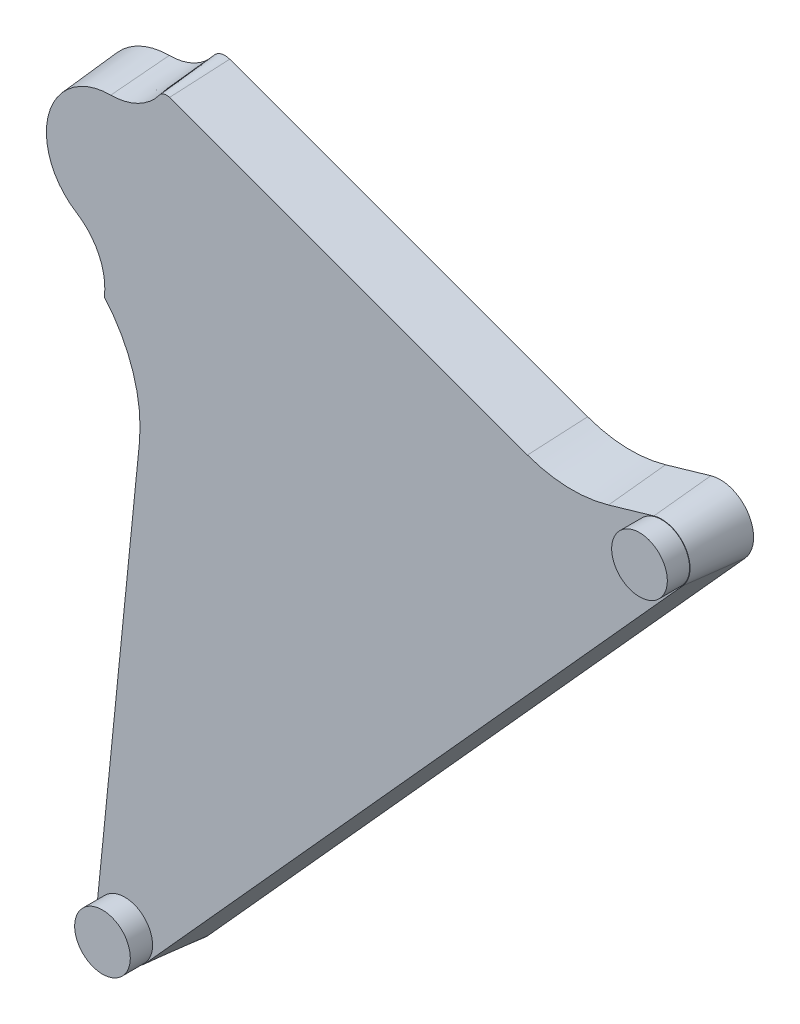
ISO-10303-21;
HEADER;
FILE_DESCRIPTION(('STEP AP214'),'2;1');
FILE_NAME('part.step','',(''),(''),'','','');
FILE_SCHEMA(('AUTOMOTIVE_DESIGN { 1 0 10303 214 1 1 1 1 }'));
ENDSEC;
DATA;
#1=APPLICATION_CONTEXT('core data for automotive mechanical design processes');
#2=APPLICATION_PROTOCOL_DEFINITION('international standard','automotive_design',2000,#1);
#3=PRODUCT_CONTEXT('',#1,'mechanical');
#4=PRODUCT('Part','Part','',(#3));
#5=PRODUCT_RELATED_PRODUCT_CATEGORY('part','',(#4));
#6=PRODUCT_DEFINITION_FORMATION('','',#4);
#7=PRODUCT_DEFINITION_CONTEXT('part definition',#1,'design');
#8=PRODUCT_DEFINITION('design','',#6,#7);
#9=PRODUCT_DEFINITION_SHAPE('','',#8);
#10=(LENGTH_UNIT() NAMED_UNIT(*) SI_UNIT(.MILLI.,.METRE.));
#11=(NAMED_UNIT(*) PLANE_ANGLE_UNIT() SI_UNIT($,.RADIAN.));
#12=(NAMED_UNIT(*) SI_UNIT($,.STERADIAN.) SOLID_ANGLE_UNIT());
#13=UNCERTAINTY_MEASURE_WITH_UNIT(LENGTH_MEASURE(1.E-05),#10,'distance_accuracy_value','');
#14=(GEOMETRIC_REPRESENTATION_CONTEXT(3) GLOBAL_UNCERTAINTY_ASSIGNED_CONTEXT((#13)) GLOBAL_UNIT_ASSIGNED_CONTEXT((#10,
#11,#12)) REPRESENTATION_CONTEXT('',''));
#15=CARTESIAN_POINT('',(0.,0.,0.));
#16=DIRECTION('',(0.,0.,1.));
#17=DIRECTION('',(1.,0.,0.));
#18=AXIS2_PLACEMENT_3D('',#15,#16,#17);
#19=CARTESIAN_POINT('',(-24.,-38.0657326213486,0.));
#20=DIRECTION('',(0.,0.,1.));
#21=DIRECTION('',(1.,0.,0.));
#22=AXIS2_PLACEMENT_3D('',#19,#20,#21);
#23=CONICAL_SURFACE('',#22,20.,0.0872664625997167);
#24=CARTESIAN_POINT('',(-24.,-38.0657326213486,0.));
#25=DIRECTION('',(0.,0.,-1.));
#26=DIRECTION('',(1.,0.,0.));
#27=AXIS2_PLACEMENT_3D('',#24,#25,#26);
#28=CIRCLE('',#27,20.);
#29=CARTESIAN_POINT('',(-13.3333333333333,-21.1476292340825,0.));
#30=VERTEX_POINT('',#29);
#31=CARTESIAN_POINT('',(-4.28464979789088,-41.4280185116614,0.));
#32=VERTEX_POINT('',#31);
#33=EDGE_CURVE('E129',#30,#32,#28,.T.);
#34=ORIENTED_EDGE('',*,*,#33,.T.);
#35=CARTESIAN_POINT('',(-2.34073281736119,-40.8482052424433,21.));
#36=CARTESIAN_POINT('',(-2.50139442564413,-40.8971555313612,19.2498944760869));
#37=CARTESIAN_POINT('',(-2.6623640559333,-40.945959511817,17.499813119764));
#38=CARTESIAN_POINT('',(-2.98495600856319,-41.0432574008663,13.9997022828302));
#39=CARTESIAN_POINT('',(-3.14657833077965,-41.0917513095186,12.2496728022095));
#40=CARTESIAN_POINT('',(-3.47051238027014,-41.1884116198143,8.74966854954999));
#41=CARTESIAN_POINT('',(-3.63282410756043,-41.2365780214499,6.99969377751241));
#42=CARTESIAN_POINT('',(-3.95817844022917,-41.3325636094536,3.49980232151207));
#43=CARTESIAN_POINT('',(-4.12122104574678,-41.3803827957556,1.74988563756043));
#44=CARTESIAN_POINT('',(-4.28464979789071,-41.4280185116616,0.));
#45=B_SPLINE_CURVE_WITH_KNOTS('',3,(#35,#36,#37,#38,#39,#40,#41,#42,#43,#44),.UNSPECIFIED.,.F.,
.F.,(4,2,2,2,4),(0.,5.27443822189284,10.5488754395707,15.8233127815579,21.0977511278854),.UNSPECIFIED.);
#46=CARTESIAN_POINT('',(-2.34073281736119,-40.8482052424433,21.));
#47=VERTEX_POINT('',#46);
#48=EDGE_CURVE('E11',#47,#32,#45,.T.);
#49=ORIENTED_EDGE('',*,*,#48,.F.);
#50=CARTESIAN_POINT('',(-24.,-38.0657326213486,21.));
#51=DIRECTION('',(0.,0.,1.));
#52=DIRECTION('',(1.,0.,0.));
#53=AXIS2_PLACEMENT_3D('',#50,#51,#52);
#54=CIRCLE('',#53,21.8372619340444);
#55=CARTESIAN_POINT('',(-12.353460301843,-19.5934798665999,21.));
#56=VERTEX_POINT('',#55);
#57=EDGE_CURVE('E168',#56,#47,#54,.F.);
#58=ORIENTED_EDGE('',*,*,#57,.F.);
#59=DIRECTION('',(-0.0464830627987511,-0.0737254933299423,-0.996194698091745));
#60=VECTOR('',#59,1.);
#61=CARTESIAN_POINT('',(-13.3333333333333,-21.1476292340825,0.));
#62=LINE('',#61,#60);
#63=EDGE_CURVE('E142',#56,#30,#62,.T.);
#64=ORIENTED_EDGE('',*,*,#63,.T.);
#65=EDGE_LOOP('',(#34,#49,#58,#64));
#66=FACE_BOUND('',#65,.T.);
#67=ADVANCED_FACE('F35',(#66),#23,.F.);
#68=CARTESIAN_POINT('',(-41.3376126881464,-75.,0.));
#69=DIRECTION('',(0.,0.,1.));
#70=DIRECTION('',(1.,0.,0.));
#71=AXIS2_PLACEMENT_3D('',#68,#69,#70);
#72=CONICAL_SURFACE('',#71,50.,0.0872664625997167);
#73=CARTESIAN_POINT('',(-41.3376126881464,-75.,0.));
#74=DIRECTION('',(0.,0.,-1.));
#75=DIRECTION('',(1.,0.,0.));
#76=AXIS2_PLACEMENT_3D('',#73,#74,#75);
#77=CIRCLE('',#76,50.);
#78=CARTESIAN_POINT('',(8.4117591671846,-80.,0.));
#79=VERTEX_POINT('',#78);
#80=EDGE_CURVE('E125',#32,#79,#77,.T.);
#81=ORIENTED_EDGE('',*,*,#80,.T.);
#82=DIRECTION('',(-0.0867188691056165,0.00871557427476584,-0.996194698091745));
#83=VECTOR('',#82,1.);
#84=CARTESIAN_POINT('',(8.4117591671846,-80.,0.));
#85=LINE('',#84,#83);
#86=CARTESIAN_POINT('',(10.239811710233,-80.1837261934045,21.));
#87=VERTEX_POINT('',#86);
#88=EDGE_CURVE('E44',#87,#79,#85,.T.);
#89=ORIENTED_EDGE('',*,*,#88,.F.);
#90=CARTESIAN_POINT('',(-41.3376126881464,-75.,21.));
#91=DIRECTION('',(0.,0.,1.));
#92=DIRECTION('',(1.,0.,0.));
#93=AXIS2_PLACEMENT_3D('',#90,#91,#92);
#94=CIRCLE('',#93,51.8372619340444);
#95=EDGE_CURVE('E138',#47,#87,#94,.F.);
#96=ORIENTED_EDGE('',*,*,#95,.F.);
#97=ORIENTED_EDGE('',*,*,#48,.T.);
#98=EDGE_LOOP('',(#81,#89,#96,#97));
#99=FACE_BOUND('',#98,.T.);
#100=ADVANCED_FACE('F137',(#99),#72,.F.);
#101=CARTESIAN_POINT('',(-6.93984924527944,-232.74657509782,0.));
#102=DIRECTION('',(-0.991201209513509,0.0996194698091746,0.0871557427476584));
#103=DIRECTION('',(-0.1,-0.99498743710662,0.));
#104=AXIS2_PLACEMENT_3D('',#101,#102,#103);
#105=PLANE('',#104);
#106=DIRECTION('',(-0.1,-0.99498743710662,0.));
#107=VECTOR('',#106,1.);
#108=CARTESIAN_POINT('',(-6.93984924527944,-232.74657509782,0.));
#109=LINE('',#108,#107);
#110=CARTESIAN_POINT('',(-6.93984924527946,-232.74657509782,0.));
#111=VERTEX_POINT('',#110);
#112=EDGE_CURVE('E131',#79,#111,#109,.T.);
#113=ORIENTED_EDGE('',*,*,#112,.T.);
#114=DIRECTION('',(-0.0867188691056165,0.00871557427476587,-0.996194698091745));
#115=VECTOR('',#114,1.);
#116=CARTESIAN_POINT('',(-6.93984924527946,-232.74657509782,0.));
#117=LINE('',#116,#115);
#118=CARTESIAN_POINT('',(-5.11179670223106,-232.930301291225,21.));
#119=VERTEX_POINT('',#118);
#120=EDGE_CURVE('E227',#119,#111,#117,.T.);
#121=ORIENTED_EDGE('',*,*,#120,.F.);
#122=DIRECTION('',(0.1,0.99498743710662,0.));
#123=VECTOR('',#122,1.);
#124=CARTESIAN_POINT('',(-5.11179670223104,-232.930301291225,21.));
#125=LINE('',#124,#123);
#126=EDGE_CURVE('E256',#87,#119,#125,.F.);
#127=ORIENTED_EDGE('',*,*,#126,.F.);
#128=ORIENTED_EDGE('',*,*,#88,.T.);
#129=EDGE_LOOP('',(#113,#121,#127,#128));
#130=FACE_BOUND('',#129,.T.);
#131=ADVANCED_FACE('F37',(#130),#105,.T.);
#132=CARTESIAN_POINT('',(5.,-233.94657509782,0.));
#133=DIRECTION('',(0.,0.,-1.));
#134=DIRECTION('',(1.,0.,0.));
#135=AXIS2_PLACEMENT_3D('',#132,#133,#134);
#136=CONICAL_SURFACE('',#135,12.,0.0872664625997167);
#137=CARTESIAN_POINT('',(5.,-233.94657509782,0.));
#138=DIRECTION('',(0.,0.,1.));
#139=DIRECTION('',(1.,0.,0.));
#140=AXIS2_PLACEMENT_3D('',#137,#138,#139);
#141=CIRCLE('',#140,12.);
#142=CARTESIAN_POINT('',(13.9104016148233,-241.984282672904,0.));
#143=VERTEX_POINT('',#142);
#144=EDGE_CURVE('E151',#111,#143,#141,.T.);
#145=ORIENTED_EDGE('',*,*,#144,.T.);
#146=DIRECTION('',(0.064716055909988,-0.058377697807907,-0.996194698091745));
#147=VECTOR('',#146,1.);
#148=CARTESIAN_POINT('',(13.9104016148232,-241.984282672904,0.));
#149=LINE('',#148,#147);
#150=CARTESIAN_POINT('',(12.546173139493,-240.75366815918,21.));
#151=VERTEX_POINT('',#150);
#152=EDGE_CURVE('E224',#151,#143,#149,.T.);
#153=ORIENTED_EDGE('',*,*,#152,.F.);
#154=CARTESIAN_POINT('',(5.,-233.94657509782,21.));
#155=DIRECTION('',(0.,0.,1.));
#156=DIRECTION('',(1.,0.,0.));
#157=AXIS2_PLACEMENT_3D('',#154,#155,#156);
#158=CIRCLE('',#157,10.1627380659556);
#159=EDGE_CURVE('E258',#119,#151,#158,.T.);
#160=ORIENTED_EDGE('',*,*,#159,.F.);
#161=ORIENTED_EDGE('',*,*,#120,.T.);
#162=EDGE_LOOP('',(#145,#153,#160,#161));
#163=FACE_BOUND('',#162,.T.);
#164=ADVANCED_FACE('F212',(#163),#136,.T.);
#165=CARTESIAN_POINT('',(206.902825712312,-28.0377075750835,0.));
#166=DIRECTION('',(0.739707903879589,-0.667260139259172,0.0871557427476584));
#167=DIRECTION('',(0.669808964590293,0.742533467901939,0.));
#168=AXIS2_PLACEMENT_3D('',#165,#166,#167);
#169=PLANE('',#168);
#170=DIRECTION('',(0.669808964590293,0.742533467901939,0.));
#171=VECTOR('',#170,1.);
#172=CARTESIAN_POINT('',(206.902825712312,-28.0377075750835,0.));
#173=LINE('',#172,#171);
#174=CARTESIAN_POINT('',(206.902825712312,-28.0377075750835,0.));
#175=VERTEX_POINT('',#174);
#176=EDGE_CURVE('E153',#143,#175,#173,.T.);
#177=ORIENTED_EDGE('',*,*,#176,.T.);
#178=DIRECTION('',(0.0647160559099881,-0.0583776978079069,-0.996194698091745));
#179=VECTOR('',#178,1.);
#180=CARTESIAN_POINT('',(206.902825712312,-28.0377075750835,0.));
#181=LINE('',#180,#179);
#182=CARTESIAN_POINT('',(205.538597236982,-26.8070930613601,21.));
#183=VERTEX_POINT('',#182);
#184=EDGE_CURVE('E232',#183,#175,#181,.T.);
#185=ORIENTED_EDGE('',*,*,#184,.F.);
#186=DIRECTION('',(-0.669808964590293,-0.742533467901939,0.));
#187=VECTOR('',#186,1.);
#188=CARTESIAN_POINT('',(205.538597236982,-26.8070930613601,21.));
#189=LINE('',#188,#187);
#190=EDGE_CURVE('E231',#151,#183,#189,.F.);
#191=ORIENTED_EDGE('',*,*,#190,.F.);
#192=ORIENTED_EDGE('',*,*,#152,.T.);
#193=EDGE_LOOP('',(#177,#185,#191,#192));
#194=FACE_BOUND('',#193,.T.);
#195=ADVANCED_FACE('F209',(#194),#169,.T.);
#196=CARTESIAN_POINT('',(197.992424097489,-20.,0.));
#197=DIRECTION('',(0.,0.,-1.));
#198=DIRECTION('',(1.,0.,0.));
#199=AXIS2_PLACEMENT_3D('',#196,#197,#198);
#200=CONICAL_SURFACE('',#199,12.,0.0872664625997167);
#201=CARTESIAN_POINT('',(197.992424097489,-20.,0.));
#202=DIRECTION('',(0.,0.,1.));
#203=DIRECTION('',(1.,0.,0.));
#204=AXIS2_PLACEMENT_3D('',#201,#202,#203);
#205=CIRCLE('',#204,12.);
#206=CARTESIAN_POINT('',(194.643197368866,-8.47686326036716,0.));
#207=VERTEX_POINT('',#206);
#208=EDGE_CURVE('E155',#175,#207,#205,.T.);
#209=ORIENTED_EDGE('',*,*,#208,.T.);
#210=DIRECTION('',(-0.0243253619302888,0.0836922951104608,-0.996194698091745));
#211=VECTOR('',#210,1.);
#212=CARTESIAN_POINT('',(194.643197368866,-8.47686326036716,0.));
#213=LINE('',#212,#211);
#214=CARTESIAN_POINT('',(195.155981266948,-10.2411149680768,21.));
#215=VERTEX_POINT('',#214);
#216=EDGE_CURVE('E240',#215,#207,#213,.T.);
#217=ORIENTED_EDGE('',*,*,#216,.F.);
#218=CARTESIAN_POINT('',(197.992424097489,-20.,21.));
#219=DIRECTION('',(0.,0.,1.));
#220=DIRECTION('',(1.,0.,0.));
#221=AXIS2_PLACEMENT_3D('',#218,#219,#220);
#222=CIRCLE('',#221,10.1627380659556);
#223=EDGE_CURVE('E261',#183,#215,#222,.T.);
#224=ORIENTED_EDGE('',*,*,#223,.F.);
#225=ORIENTED_EDGE('',*,*,#184,.T.);
#226=EDGE_LOOP('',(#209,#217,#224,#225));
#227=FACE_BOUND('',#226,.T.);
#228=ADVANCED_FACE('F205',(#227),#200,.T.);
#229=CARTESIAN_POINT('',(194.643197368866,-8.47686326036716,0.));
#230=DIRECTION('',(-0.2780401591468,0.956607310450702,0.0871557427476584));
#231=DIRECTION('',(-0.960261394969402,-0.279102227385268,0.));
#232=AXIS2_PLACEMENT_3D('',#229,#230,#231);
#233=PLANE('',#232);
#234=DIRECTION('',(-0.960261394969402,-0.279102227385268,0.));
#235=VECTOR('',#234,1.);
#236=CARTESIAN_POINT('',(194.643197368866,-8.47686326036716,0.));
#237=LINE('',#236,#235);
#238=CARTESIAN_POINT('',(178.352602864355,-13.2117627736231,0.));
#239=VERTEX_POINT('',#238);
#240=EDGE_CURVE('E157',#207,#239,#237,.T.);
#241=ORIENTED_EDGE('',*,*,#240,.T.);
#242=DIRECTION('',(-0.0243253619302888,0.0836922951104608,-0.996194698091745));
#243=VECTOR('',#242,1.);
#244=CARTESIAN_POINT('',(178.352602864355,-13.2117627736231,0.));
#245=LINE('',#244,#243);
#246=CARTESIAN_POINT('',(178.865386762437,-14.9760144813327,21.));
#247=VERTEX_POINT('',#246);
#248=EDGE_CURVE('E245',#247,#239,#245,.T.);
#249=ORIENTED_EDGE('',*,*,#248,.F.);
#250=DIRECTION('',(0.960261394969402,0.279102227385268,0.));
#251=VECTOR('',#250,1.);
#252=CARTESIAN_POINT('',(195.155981266948,-10.2411149680768,21.));
#253=LINE('',#252,#251);
#254=EDGE_CURVE('E244',#215,#247,#253,.F.);
#255=ORIENTED_EDGE('',*,*,#254,.F.);
#256=ORIENTED_EDGE('',*,*,#216,.T.);
#257=EDGE_LOOP('',(#241,#249,#255,#256));
#258=FACE_BOUND('',#257,.T.);
#259=ADVANCED_FACE('F201',(#258),#233,.T.);
#260=CARTESIAN_POINT('',(165.793002632018,30.,0.));
#261=DIRECTION('',(0.,0.,1.));
#262=DIRECTION('',(-1.,0.,0.));
#263=AXIS2_PLACEMENT_3D('',#260,#261,#262);
#264=CONICAL_SURFACE('',#263,45.,0.0872664625997167);
#265=CARTESIAN_POINT('',(165.793002632018,30.,0.));
#266=DIRECTION('',(0.,0.,-1.));
#267=DIRECTION('',(-1.,0.,0.));
#268=AXIS2_PLACEMENT_3D('',#265,#266,#267);
#269=CIRCLE('',#268,45.);
#270=CARTESIAN_POINT('',(150.360163199532,-12.2708820235761,0.));
#271=VERTEX_POINT('',#270);
#272=EDGE_CURVE('E159',#239,#271,#269,.T.);
#273=ORIENTED_EDGE('',*,*,#272,.T.);
#274=DIRECTION('',(0.0298902351876377,0.0818700026525204,-0.996194698091745));
#275=VECTOR('',#274,1.);
#276=CARTESIAN_POINT('',(150.360163199532,-12.2708820235761,0.));
#277=LINE('',#276,#275);
#278=CARTESIAN_POINT('',(149.730070567898,-13.996719411585,21.));
#279=VERTEX_POINT('',#278);
#280=EDGE_CURVE('E248',#279,#271,#277,.T.);
#281=ORIENTED_EDGE('',*,*,#280,.F.);
#282=CARTESIAN_POINT('',(165.793002632018,30.,21.));
#283=DIRECTION('',(0.,0.,1.));
#284=DIRECTION('',(1.,0.,0.));
#285=AXIS2_PLACEMENT_3D('',#282,#283,#284);
#286=CIRCLE('',#285,46.8372619340444);
#287=EDGE_CURVE('E264',#247,#279,#286,.F.);
#288=ORIENTED_EDGE('',*,*,#287,.F.);
#289=ORIENTED_EDGE('',*,*,#248,.T.);
#290=EDGE_LOOP('',(#273,#281,#288,#289));
#291=FACE_BOUND('',#290,.T.);
#292=ADVANCED_FACE('F197',(#291),#264,.F.);
#293=CARTESIAN_POINT('',(150.360163199532,-12.2708820235761,0.));
#294=DIRECTION('',(0.341646951536536,0.935778412345517,0.0871557427476584));
#295=DIRECTION('',(-0.939352933857248,0.342951987388586,0.));
#296=AXIS2_PLACEMENT_3D('',#293,#294,#295);
#297=PLANE('',#296);
#298=DIRECTION('',(-0.939352933857248,0.342951987388585,0.));
#299=VECTOR('',#298,1.);
#300=CARTESIAN_POINT('',(150.360163199532,-12.2708820235761,0.));
#301=LINE('',#300,#299);
#302=CARTESIAN_POINT('',(21.7147599369429,34.6967646692862,0.));
#303=VERTEX_POINT('',#302);
#304=EDGE_CURVE('E161',#271,#303,#301,.T.);
#305=ORIENTED_EDGE('',*,*,#304,.T.);
#306=DIRECTION('',(0.0298902351876377,0.0818700026525205,-0.996194698091745));
#307=VECTOR('',#306,1.);
#308=CARTESIAN_POINT('',(21.7147599369429,34.6967646692862,0.));
#309=LINE('',#308,#307);
#310=CARTESIAN_POINT('',(21.084667305309,32.9709272812774,21.));
#311=VERTEX_POINT('',#310);
#312=EDGE_CURVE('E273',#311,#303,#309,.T.);
#313=ORIENTED_EDGE('',*,*,#312,.F.);
#314=DIRECTION('',(0.939352933857248,-0.342951987388586,0.));
#315=VECTOR('',#314,1.);
#316=CARTESIAN_POINT('',(149.730070567898,-13.996719411585,21.));
#317=LINE('',#316,#315);
#318=EDGE_CURVE('E266',#279,#311,#317,.F.);
#319=ORIENTED_EDGE('',*,*,#318,.F.);
#320=ORIENTED_EDGE('',*,*,#280,.T.);
#321=EDGE_LOOP('',(#305,#313,#319,#320));
#322=FACE_BOUND('',#321,.T.);
#323=ADVANCED_FACE('F193',(#322),#297,.T.);
#324=CARTESIAN_POINT('',(20.,30.,0.));
#325=DIRECTION('',(0.,0.,-1.));
#326=DIRECTION('',(1.,0.,0.));
#327=AXIS2_PLACEMENT_3D('',#324,#325,#326);
#328=CONICAL_SURFACE('',#327,5.00000000000001,0.0872664625997167);
#329=CARTESIAN_POINT('',(20.,30.,0.));
#330=DIRECTION('',(0.,0.,1.));
#331=DIRECTION('',(1.,0.,0.));
#332=AXIS2_PLACEMENT_3D('',#329,#330,#331);
#333=CIRCLE('',#332,5.00000000000001);
#334=CARTESIAN_POINT('',(16.,33.,0.));
#335=VERTEX_POINT('',#334);
#336=EDGE_CURVE('E163',#303,#335,#333,.T.);
#337=ORIENTED_EDGE('',*,*,#336,.T.);
#338=DIRECTION('',(-0.0697245941981267,0.052293445648595,-0.996194698091745));
#339=VECTOR('',#338,1.);
#340=CARTESIAN_POINT('',(16.,33.,0.));
#341=LINE('',#340,#339);
#342=CARTESIAN_POINT('',(17.4698095472355,31.8976428395734,21.));
#343=VERTEX_POINT('',#342);
#344=EDGE_CURVE('E271',#343,#335,#341,.T.);
#345=ORIENTED_EDGE('',*,*,#344,.F.);
#346=CARTESIAN_POINT('',(20.,30.,21.));
#347=DIRECTION('',(0.,0.,1.));
#348=DIRECTION('',(1.,0.,0.));
#349=AXIS2_PLACEMENT_3D('',#346,#347,#348);
#350=CIRCLE('',#349,3.1627380659556);
#351=EDGE_CURVE('E268',#311,#343,#350,.T.);
#352=ORIENTED_EDGE('',*,*,#351,.F.);
#353=ORIENTED_EDGE('',*,*,#312,.T.);
#354=EDGE_LOOP('',(#337,#345,#352,#353));
#355=FACE_BOUND('',#354,.T.);
#356=ADVANCED_FACE('F189',(#355),#328,.T.);
#357=CARTESIAN_POINT('',(0.,45.,0.));
#358=DIRECTION('',(0.,0.,1.));
#359=DIRECTION('',(1.,0.,0.));
#360=AXIS2_PLACEMENT_3D('',#357,#358,#359);
#361=CONICAL_SURFACE('',#360,20.,0.0872664625997167);
#362=CARTESIAN_POINT('',(0.,45.,0.));
#363=DIRECTION('',(0.,0.,-1.));
#364=DIRECTION('',(1.,0.,0.));
#365=AXIS2_PLACEMENT_3D('',#362,#363,#364);
#366=CIRCLE('',#365,20.);
#367=CARTESIAN_POINT('',(0.,25.,0.));
#368=VERTEX_POINT('',#367);
#369=EDGE_CURVE('E165',#335,#368,#366,.T.);
#370=ORIENTED_EDGE('',*,*,#369,.T.);
#371=DIRECTION('',(0.,0.0871557427476583,-0.996194698091745));
#372=VECTOR('',#371,1.);
#373=CARTESIAN_POINT('',(0.,25.,0.));
#374=LINE('',#373,#372);
#375=CARTESIAN_POINT('',(0.,23.1627380659556,21.));
#376=VERTEX_POINT('',#375);
#377=EDGE_CURVE('E269',#376,#368,#374,.T.);
#378=ORIENTED_EDGE('',*,*,#377,.F.);
#379=CARTESIAN_POINT('',(0.,45.,21.));
#380=DIRECTION('',(0.,0.,1.));
#381=DIRECTION('',(1.,0.,0.));
#382=AXIS2_PLACEMENT_3D('',#379,#380,#381);
#383=CIRCLE('',#382,21.8372619340444);
#384=EDGE_CURVE('E56',#343,#376,#383,.F.);
#385=ORIENTED_EDGE('',*,*,#384,.F.);
#386=ORIENTED_EDGE('',*,*,#344,.T.);
#387=EDGE_LOOP('',(#370,#378,#385,#386));
#388=FACE_BOUND('',#387,.T.);
#389=ADVANCED_FACE('F185',(#388),#361,.F.);
#390=CARTESIAN_POINT('',(0.,0.,0.));
#391=DIRECTION('',(0.,0.,-1.));
#392=DIRECTION('',(1.,0.,0.));
#393=AXIS2_PLACEMENT_3D('',#390,#391,#392);
#394=CONICAL_SURFACE('',#393,25.,0.0872664625997167);
#395=CARTESIAN_POINT('',(0.,0.,0.));
#396=DIRECTION('',(0.,0.,1.));
#397=DIRECTION('',(1.,0.,0.));
#398=AXIS2_PLACEMENT_3D('',#395,#396,#397);
#399=CIRCLE('',#398,25.);
#400=EDGE_CURVE('E167',#368,#30,#399,.T.);
#401=ORIENTED_EDGE('',*,*,#400,.T.);
#402=ORIENTED_EDGE('',*,*,#63,.F.);
#403=CARTESIAN_POINT('',(0.,0.,21.));
#404=DIRECTION('',(0.,0.,1.));
#405=DIRECTION('',(1.,0.,0.));
#406=AXIS2_PLACEMENT_3D('',#403,#404,#405);
#407=CIRCLE('',#406,23.1627380659556);
#408=EDGE_CURVE('E39',#376,#56,#407,.T.);
#409=ORIENTED_EDGE('',*,*,#408,.F.);
#410=ORIENTED_EDGE('',*,*,#377,.T.);
#411=EDGE_LOOP('',(#401,#402,#409,#410));
#412=FACE_BOUND('',#411,.T.);
#413=ADVANCED_FACE('F181',(#412),#394,.T.);
#414=CARTESIAN_POINT('',(-24.,-38.0657326213486,21.));
#415=DIRECTION('',(0.,0.,1.));
#416=DIRECTION('',(1.,0.,0.));
#417=AXIS2_PLACEMENT_3D('',#414,#415,#416);
#418=PLANE('',#417);
#419=CARTESIAN_POINT('',(197.992424097489,-20.,21.));
#420=DIRECTION('',(0.,0.,1.));
#421=DIRECTION('',(1.,0.,0.));
#422=AXIS2_PLACEMENT_3D('',#419,#420,#421);
#423=CIRCLE('',#422,10.);
#424=CARTESIAN_POINT('',(207.992424097489,-20.,21.));
#425=VERTEX_POINT('',#424);
#426=EDGE_CURVE('E319',#425,#425,#423,.T.);
#427=ORIENTED_EDGE('',*,*,#426,.F.);
#428=EDGE_LOOP('',(#427));
#429=FACE_BOUND('',#428,.T.);
#430=CARTESIAN_POINT('',(5.,-233.94657509782,21.));
#431=DIRECTION('',(0.,0.,1.));
#432=DIRECTION('',(1.,0.,0.));
#433=AXIS2_PLACEMENT_3D('',#430,#431,#432);
#434=CIRCLE('',#433,10.);
#435=CARTESIAN_POINT('',(15.,-233.94657509782,21.));
#436=VERTEX_POINT('',#435);
#437=EDGE_CURVE('E146',#436,#436,#434,.T.);
#438=ORIENTED_EDGE('',*,*,#437,.F.);
#439=EDGE_LOOP('',(#438));
#440=FACE_BOUND('',#439,.T.);
#441=ORIENTED_EDGE('',*,*,#57,.T.);
#442=ORIENTED_EDGE('',*,*,#95,.T.);
#443=ORIENTED_EDGE('',*,*,#126,.T.);
#444=ORIENTED_EDGE('',*,*,#159,.T.);
#445=ORIENTED_EDGE('',*,*,#190,.T.);
#446=ORIENTED_EDGE('',*,*,#223,.T.);
#447=ORIENTED_EDGE('',*,*,#254,.T.);
#448=ORIENTED_EDGE('',*,*,#287,.T.);
#449=ORIENTED_EDGE('',*,*,#318,.T.);
#450=ORIENTED_EDGE('',*,*,#351,.T.);
#451=ORIENTED_EDGE('',*,*,#384,.T.);
#452=ORIENTED_EDGE('',*,*,#408,.T.);
#453=EDGE_LOOP('',(#441,#442,#443,#444,#445,#446,#447,#448,#449,#450,#451,#452));
#454=FACE_BOUND('',#453,.T.);
#455=ADVANCED_FACE('F184',(#429,#440,#454),#418,.T.);
#456=CARTESIAN_POINT('',(-24.,-38.0657326213486,0.));
#457=DIRECTION('',(0.,0.,1.));
#458=DIRECTION('',(1.,0.,0.));
#459=AXIS2_PLACEMENT_3D('',#456,#457,#458);
#460=PLANE('',#459);
#461=ORIENTED_EDGE('',*,*,#33,.F.);
#462=ORIENTED_EDGE('',*,*,#400,.F.);
#463=ORIENTED_EDGE('',*,*,#369,.F.);
#464=ORIENTED_EDGE('',*,*,#336,.F.);
#465=ORIENTED_EDGE('',*,*,#304,.F.);
#466=ORIENTED_EDGE('',*,*,#272,.F.);
#467=ORIENTED_EDGE('',*,*,#240,.F.);
#468=ORIENTED_EDGE('',*,*,#208,.F.);
#469=ORIENTED_EDGE('',*,*,#176,.F.);
#470=ORIENTED_EDGE('',*,*,#144,.F.);
#471=ORIENTED_EDGE('',*,*,#112,.F.);
#472=ORIENTED_EDGE('',*,*,#80,.F.);
#473=EDGE_LOOP('',(#461,#462,#463,#464,#465,#466,#467,#468,#469,#470,#471,#472));
#474=FACE_BOUND('',#473,.T.);
#475=ADVANCED_FACE('F126',(#474),#460,.F.);
#476=CARTESIAN_POINT('',(5.,-233.94657509782,29.));
#477=DIRECTION('',(0.,0.,-1.));
#478=DIRECTION('',(-1.,0.,0.));
#479=AXIS2_PLACEMENT_3D('',#476,#477,#478);
#480=CYLINDRICAL_SURFACE('',#479,10.);
#481=CARTESIAN_POINT('',(5.,-233.94657509782,29.));
#482=DIRECTION('',(0.,0.,1.));
#483=DIRECTION('',(1.,0.,0.));
#484=AXIS2_PLACEMENT_3D('',#481,#482,#483);
#485=CIRCLE('',#484,10.);
#486=CARTESIAN_POINT('',(15.,-233.94657509782,29.));
#487=VERTEX_POINT('',#486);
#488=EDGE_CURVE('E143',#487,#487,#485,.T.);
#489=ORIENTED_EDGE('',*,*,#488,.F.);
#490=EDGE_LOOP('',(#489));
#491=FACE_BOUND('',#490,.T.);
#492=ORIENTED_EDGE('',*,*,#437,.T.);
#493=EDGE_LOOP('',(#492));
#494=FACE_BOUND('',#493,.T.);
#495=ADVANCED_FACE('F296',(#491,#494),#480,.T.);
#496=CARTESIAN_POINT('',(5.,-233.94657509782,29.));
#497=DIRECTION('',(0.,0.,1.));
#498=DIRECTION('',(1.,0.,0.));
#499=AXIS2_PLACEMENT_3D('',#496,#497,#498);
#500=PLANE('',#499);
#501=ORIENTED_EDGE('',*,*,#488,.T.);
#502=EDGE_LOOP('',(#501));
#503=FACE_BOUND('',#502,.T.);
#504=ADVANCED_FACE('F302',(#503),#500,.T.);
#505=CARTESIAN_POINT('',(197.992424097489,-20.,29.));
#506=DIRECTION('',(0.,0.,-1.));
#507=DIRECTION('',(-1.,0.,0.));
#508=AXIS2_PLACEMENT_3D('',#505,#506,#507);
#509=CYLINDRICAL_SURFACE('',#508,10.);
#510=CARTESIAN_POINT('',(197.992424097489,-20.,29.));
#511=DIRECTION('',(0.,0.,1.));
#512=DIRECTION('',(1.,0.,0.));
#513=AXIS2_PLACEMENT_3D('',#510,#511,#512);
#514=CIRCLE('',#513,10.);
#515=CARTESIAN_POINT('',(207.992424097489,-20.,29.));
#516=VERTEX_POINT('',#515);
#517=EDGE_CURVE('E318',#516,#516,#514,.T.);
#518=ORIENTED_EDGE('',*,*,#517,.F.);
#519=EDGE_LOOP('',(#518));
#520=FACE_BOUND('',#519,.T.);
#521=ORIENTED_EDGE('',*,*,#426,.T.);
#522=EDGE_LOOP('',(#521));
#523=FACE_BOUND('',#522,.T.);
#524=ADVANCED_FACE('F306',(#520,#523),#509,.T.);
#525=CARTESIAN_POINT('',(197.992424097489,-20.,29.));
#526=DIRECTION('',(0.,0.,1.));
#527=DIRECTION('',(1.,0.,0.));
#528=AXIS2_PLACEMENT_3D('',#525,#526,#527);
#529=PLANE('',#528);
#530=ORIENTED_EDGE('',*,*,#517,.T.);
#531=EDGE_LOOP('',(#530));
#532=FACE_BOUND('',#531,.T.);
#533=ADVANCED_FACE('F310',(#532),#529,.T.);
#534=CLOSED_SHELL('',(#67,#100,#131,#164,#195,#228,#259,#292,#323,#356,#389,#413,#455,#475,#495,
#504,#524,#533));
#535=MANIFOLD_SOLID_BREP('B2',#534);
#536=ADVANCED_BREP_SHAPE_REPRESENTATION('',(#18,#535),#14);
#537=SHAPE_DEFINITION_REPRESENTATION(#9,#536);
ENDSEC;
END-ISO-10303-21;
